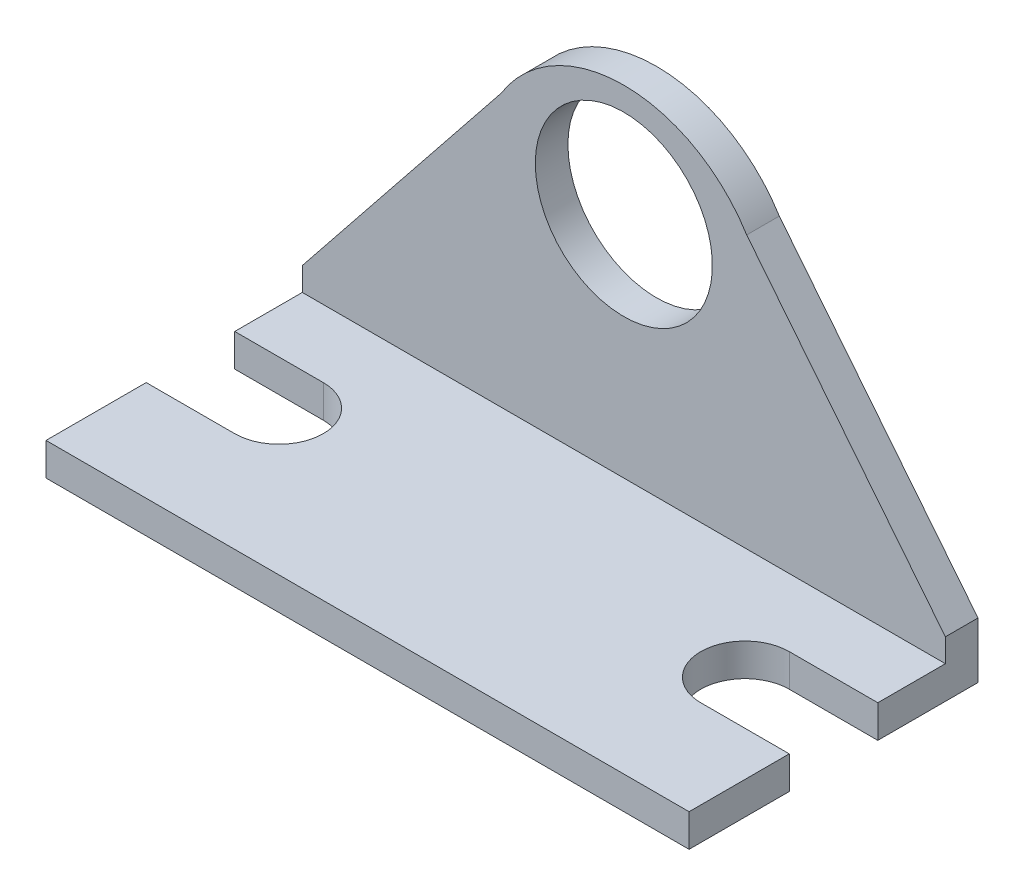
ISO-10303-21;
HEADER;
FILE_DESCRIPTION(('STEP AP214'),'2;1');
FILE_NAME('part.step','',(''),(''),'','','');
FILE_SCHEMA(('AUTOMOTIVE_DESIGN { 1 0 10303 214 1 1 1 1 }'));
ENDSEC;
DATA;
#1=APPLICATION_CONTEXT('core data for automotive mechanical design processes');
#2=APPLICATION_PROTOCOL_DEFINITION('international standard','automotive_design',2000,#1);
#3=PRODUCT_CONTEXT('',#1,'mechanical');
#4=PRODUCT('Part','Part','',(#3));
#5=PRODUCT_RELATED_PRODUCT_CATEGORY('part','',(#4));
#6=PRODUCT_DEFINITION_FORMATION('','',#4);
#7=PRODUCT_DEFINITION_CONTEXT('part definition',#1,'design');
#8=PRODUCT_DEFINITION('design','',#6,#7);
#9=PRODUCT_DEFINITION_SHAPE('','',#8);
#10=(LENGTH_UNIT() NAMED_UNIT(*) SI_UNIT(.MILLI.,.METRE.));
#11=(NAMED_UNIT(*) PLANE_ANGLE_UNIT() SI_UNIT($,.RADIAN.));
#12=(NAMED_UNIT(*) SI_UNIT($,.STERADIAN.) SOLID_ANGLE_UNIT());
#13=UNCERTAINTY_MEASURE_WITH_UNIT(LENGTH_MEASURE(1.E-05),#10,'distance_accuracy_value','');
#14=(GEOMETRIC_REPRESENTATION_CONTEXT(3) GLOBAL_UNCERTAINTY_ASSIGNED_CONTEXT((#13)) GLOBAL_UNIT_ASSIGNED_CONTEXT((#10,
#11,#12)) REPRESENTATION_CONTEXT('',''));
#15=CARTESIAN_POINT('',(0.,0.,0.));
#16=DIRECTION('',(0.,0.,1.));
#17=DIRECTION('',(1.,0.,0.));
#18=AXIS2_PLACEMENT_3D('',#15,#16,#17);
#19=CARTESIAN_POINT('',(0.,1.778,7.874));
#20=DIRECTION('',(0.,0.,-1.));
#21=DIRECTION('',(-1.,0.,0.));
#22=AXIS2_PLACEMENT_3D('',#19,#20,#21);
#23=PLANE('',#22);
#24=DIRECTION('',(1.,0.,0.));
#25=VECTOR('',#24,1.);
#26=CARTESIAN_POINT('',(0.,0.,7.874));
#27=LINE('',#26,#25);
#28=CARTESIAN_POINT('',(-17.526,0.,7.874));
#29=VERTEX_POINT('',#28);
#30=CARTESIAN_POINT('',(17.526,0.,7.874));
#31=VERTEX_POINT('',#30);
#32=EDGE_CURVE('E162',#29,#31,#27,.T.);
#33=ORIENTED_EDGE('',*,*,#32,.T.);
#34=DIRECTION('',(0.,-1.,0.));
#35=VECTOR('',#34,1.);
#36=CARTESIAN_POINT('',(17.526,1.778,7.874));
#37=LINE('',#36,#35);
#38=CARTESIAN_POINT('',(17.526,1.778,7.874));
#39=VERTEX_POINT('',#38);
#40=EDGE_CURVE('E11',#39,#31,#37,.T.);
#41=ORIENTED_EDGE('',*,*,#40,.F.);
#42=DIRECTION('',(1.,0.,0.));
#43=VECTOR('',#42,1.);
#44=CARTESIAN_POINT('',(0.,1.778,7.874));
#45=LINE('',#44,#43);
#46=CARTESIAN_POINT('',(-17.526,1.778,7.874));
#47=VERTEX_POINT('',#46);
#48=EDGE_CURVE('E109',#47,#39,#45,.T.);
#49=ORIENTED_EDGE('',*,*,#48,.F.);
#50=DIRECTION('',(0.,-1.,0.));
#51=VECTOR('',#50,1.);
#52=CARTESIAN_POINT('',(-17.526,1.778,7.874));
#53=LINE('',#52,#51);
#54=EDGE_CURVE('E161',#47,#29,#53,.T.);
#55=ORIENTED_EDGE('',*,*,#54,.T.);
#56=EDGE_LOOP('',(#33,#41,#49,#55));
#57=FACE_BOUND('',#56,.T.);
#58=ADVANCED_FACE('F35',(#57),#23,.F.);
#59=CARTESIAN_POINT('',(17.526,1.778,0.));
#60=DIRECTION('',(1.,0.,0.));
#61=DIRECTION('',(0.,0.,-1.));
#62=AXIS2_PLACEMENT_3D('',#59,#60,#61);
#63=PLANE('',#62);
#64=DIRECTION('',(0.,0.,1.));
#65=VECTOR('',#64,1.);
#66=CARTESIAN_POINT('',(17.526,0.,0.));
#67=LINE('',#66,#65);
#68=CARTESIAN_POINT('',(17.526,0.,2.413));
#69=VERTEX_POINT('',#68);
#70=EDGE_CURVE('E165',#69,#31,#67,.T.);
#71=ORIENTED_EDGE('',*,*,#70,.F.);
#72=DIRECTION('',(0.,-1.,0.));
#73=VECTOR('',#72,1.);
#74=CARTESIAN_POINT('',(17.526,1.778,2.413));
#75=LINE('',#74,#73);
#76=CARTESIAN_POINT('',(17.526,1.778,2.413));
#77=VERTEX_POINT('',#76);
#78=EDGE_CURVE('E43',#77,#69,#75,.T.);
#79=ORIENTED_EDGE('',*,*,#78,.F.);
#80=DIRECTION('',(0.,0.,1.));
#81=VECTOR('',#80,1.);
#82=CARTESIAN_POINT('',(17.526,1.778,0.));
#83=LINE('',#82,#81);
#84=EDGE_CURVE('E224',#77,#39,#83,.T.);
#85=ORIENTED_EDGE('',*,*,#84,.T.);
#86=ORIENTED_EDGE('',*,*,#40,.T.);
#87=EDGE_LOOP('',(#71,#79,#85,#86));
#88=FACE_BOUND('',#87,.T.);
#89=ADVANCED_FACE('F324',(#88),#63,.T.);
#90=CARTESIAN_POINT('',(0.,1.778,2.41299999999998));
#91=DIRECTION('',(0.,0.,-1.));
#92=DIRECTION('',(-1.,0.,0.));
#93=AXIS2_PLACEMENT_3D('',#90,#91,#92);
#94=PLANE('',#93);
#95=DIRECTION('',(1.,0.,0.));
#96=VECTOR('',#95,1.);
#97=CARTESIAN_POINT('',(0.,0.,2.41299999999998));
#98=LINE('',#97,#96);
#99=CARTESIAN_POINT('',(12.7,0.,2.41299999999999));
#100=VERTEX_POINT('',#99);
#101=EDGE_CURVE('E169',#100,#69,#98,.T.);
#102=ORIENTED_EDGE('',*,*,#101,.F.);
#103=DIRECTION('',(0.,-1.,0.));
#104=VECTOR('',#103,1.);
#105=CARTESIAN_POINT('',(12.7,1.778,2.41299999999999));
#106=LINE('',#105,#104);
#107=CARTESIAN_POINT('',(12.7,1.778,2.41299999999999));
#108=VERTEX_POINT('',#107);
#109=EDGE_CURVE('E207',#108,#100,#106,.T.);
#110=ORIENTED_EDGE('',*,*,#109,.F.);
#111=DIRECTION('',(1.,0.,0.));
#112=VECTOR('',#111,1.);
#113=CARTESIAN_POINT('',(0.,1.778,2.41299999999998));
#114=LINE('',#113,#112);
#115=EDGE_CURVE('E221',#108,#77,#114,.T.);
#116=ORIENTED_EDGE('',*,*,#115,.T.);
#117=ORIENTED_EDGE('',*,*,#78,.T.);
#118=EDGE_LOOP('',(#102,#110,#116,#117));
#119=FACE_BOUND('',#118,.T.);
#120=ADVANCED_FACE('F329',(#119),#94,.T.);
#121=CARTESIAN_POINT('',(12.7,1.778,0.));
#122=DIRECTION('',(0.,-1.,0.));
#123=DIRECTION('',(0.,0.,-1.));
#124=AXIS2_PLACEMENT_3D('',#121,#122,#123);
#125=CYLINDRICAL_SURFACE('',#124,2.41299999999999);
#126=CARTESIAN_POINT('',(12.7,0.,0.));
#127=DIRECTION('',(0.,1.,0.));
#128=DIRECTION('',(0.,0.,1.));
#129=AXIS2_PLACEMENT_3D('',#126,#127,#128);
#130=CIRCLE('',#129,2.41299999999999);
#131=CARTESIAN_POINT('',(12.7,0.,-2.413));
#132=VERTEX_POINT('',#131);
#133=EDGE_CURVE('E172',#100,#132,#130,.F.);
#134=ORIENTED_EDGE('',*,*,#133,.T.);
#135=DIRECTION('',(0.,-1.,0.));
#136=VECTOR('',#135,1.);
#137=CARTESIAN_POINT('',(12.7,1.778,-2.413));
#138=LINE('',#137,#136);
#139=CARTESIAN_POINT('',(12.7,1.778,-2.413));
#140=VERTEX_POINT('',#139);
#141=EDGE_CURVE('E204',#140,#132,#138,.T.);
#142=ORIENTED_EDGE('',*,*,#141,.F.);
#143=CARTESIAN_POINT('',(12.7,1.778,0.));
#144=DIRECTION('',(0.,1.,0.));
#145=DIRECTION('',(0.,0.,1.));
#146=AXIS2_PLACEMENT_3D('',#143,#144,#145);
#147=CIRCLE('',#146,2.41299999999999);
#148=EDGE_CURVE('E219',#108,#140,#147,.F.);
#149=ORIENTED_EDGE('',*,*,#148,.F.);
#150=ORIENTED_EDGE('',*,*,#109,.T.);
#151=EDGE_LOOP('',(#134,#142,#149,#150));
#152=FACE_BOUND('',#151,.T.);
#153=ADVANCED_FACE('F320',(#152),#125,.F.);
#154=CARTESIAN_POINT('',(0.,1.778,-2.41299999999999));
#155=DIRECTION('',(0.,0.,-1.));
#156=DIRECTION('',(-1.,0.,0.));
#157=AXIS2_PLACEMENT_3D('',#154,#155,#156);
#158=PLANE('',#157);
#159=DIRECTION('',(1.,0.,0.));
#160=VECTOR('',#159,1.);
#161=CARTESIAN_POINT('',(0.,0.,-2.41299999999999));
#162=LINE('',#161,#160);
#163=CARTESIAN_POINT('',(17.526,0.,-2.413));
#164=VERTEX_POINT('',#163);
#165=EDGE_CURVE('E174',#132,#164,#162,.T.);
#166=ORIENTED_EDGE('',*,*,#165,.T.);
#167=DIRECTION('',(0.,-1.,0.));
#168=VECTOR('',#167,1.);
#169=CARTESIAN_POINT('',(17.526,1.778,-2.413));
#170=LINE('',#169,#168);
#171=CARTESIAN_POINT('',(17.526,1.778,-2.413));
#172=VERTEX_POINT('',#171);
#173=EDGE_CURVE('E201',#172,#164,#170,.T.);
#174=ORIENTED_EDGE('',*,*,#173,.F.);
#175=DIRECTION('',(1.,0.,0.));
#176=VECTOR('',#175,1.);
#177=CARTESIAN_POINT('',(0.,1.778,-2.41299999999999));
#178=LINE('',#177,#176);
#179=EDGE_CURVE('E213',#140,#172,#178,.T.);
#180=ORIENTED_EDGE('',*,*,#179,.F.);
#181=ORIENTED_EDGE('',*,*,#141,.T.);
#182=EDGE_LOOP('',(#166,#174,#180,#181));
#183=FACE_BOUND('',#182,.T.);
#184=ADVANCED_FACE('F313',(#183),#158,.F.);
#185=CARTESIAN_POINT('',(17.526,1.778,0.));
#186=DIRECTION('',(-1.,0.,0.));
#187=DIRECTION('',(0.,0.,1.));
#188=AXIS2_PLACEMENT_3D('',#185,#186,#187);
#189=PLANE('',#188);
#190=DIRECTION('',(0.,0.,-1.));
#191=VECTOR('',#190,1.);
#192=CARTESIAN_POINT('',(17.526,0.,0.));
#193=LINE('',#192,#191);
#194=CARTESIAN_POINT('',(17.526,0.,-7.874));
#195=VERTEX_POINT('',#194);
#196=EDGE_CURVE('E176',#164,#195,#193,.T.);
#197=ORIENTED_EDGE('',*,*,#196,.T.);
#198=DIRECTION('',(0.,-1.,0.));
#199=VECTOR('',#198,1.);
#200=CARTESIAN_POINT('',(17.526,1.778,-7.874));
#201=LINE('',#200,#199);
#202=CARTESIAN_POINT('',(17.526,3.048,-7.874));
#203=VERTEX_POINT('',#202);
#204=EDGE_CURVE('E199',#203,#195,#201,.T.);
#205=ORIENTED_EDGE('',*,*,#204,.F.);
#206=DIRECTION('',(0.,0.,-1.));
#207=VECTOR('',#206,1.);
#208=CARTESIAN_POINT('',(17.526,3.048,-6.096));
#209=LINE('',#208,#207);
#210=CARTESIAN_POINT('',(17.526,3.048,-6.096));
#211=VERTEX_POINT('',#210);
#212=EDGE_CURVE('E235',#211,#203,#209,.T.);
#213=ORIENTED_EDGE('',*,*,#212,.F.);
#214=DIRECTION('',(0.,1.,0.));
#215=VECTOR('',#214,1.);
#216=CARTESIAN_POINT('',(17.526,0.,-6.096));
#217=LINE('',#216,#215);
#218=CARTESIAN_POINT('',(17.526,1.778,-6.096));
#219=VERTEX_POINT('',#218);
#220=EDGE_CURVE('E259',#219,#211,#217,.T.);
#221=ORIENTED_EDGE('',*,*,#220,.F.);
#222=DIRECTION('',(0.,0.,-1.));
#223=VECTOR('',#222,1.);
#224=CARTESIAN_POINT('',(17.526,1.778,0.));
#225=LINE('',#224,#223);
#226=EDGE_CURVE('E210',#172,#219,#225,.T.);
#227=ORIENTED_EDGE('',*,*,#226,.F.);
#228=ORIENTED_EDGE('',*,*,#173,.T.);
#229=EDGE_LOOP('',(#197,#205,#213,#221,#227,#228));
#230=FACE_BOUND('',#229,.T.);
#231=ADVANCED_FACE('F309',(#230),#189,.F.);
#232=CARTESIAN_POINT('',(0.,1.778,-7.874));
#233=DIRECTION('',(0.,0.,-1.));
#234=DIRECTION('',(-1.,0.,0.));
#235=AXIS2_PLACEMENT_3D('',#232,#233,#234);
#236=PLANE('',#235);
#237=DIRECTION('',(1.,0.,0.));
#238=VECTOR('',#237,1.);
#239=CARTESIAN_POINT('',(0.,0.,-7.874));
#240=LINE('',#239,#238);
#241=CARTESIAN_POINT('',(-17.526,0.,-7.874));
#242=VERTEX_POINT('',#241);
#243=EDGE_CURVE('E179',#242,#195,#240,.T.);
#244=ORIENTED_EDGE('',*,*,#243,.F.);
#245=DIRECTION('',(0.,-1.,0.));
#246=VECTOR('',#245,1.);
#247=CARTESIAN_POINT('',(-17.526,1.778,-7.874));
#248=LINE('',#247,#246);
#249=CARTESIAN_POINT('',(-17.526,3.048,-7.874));
#250=VERTEX_POINT('',#249);
#251=EDGE_CURVE('E197',#250,#242,#248,.T.);
#252=ORIENTED_EDGE('',*,*,#251,.F.);
#253=DIRECTION('',(0.624572109785779,0.780967143788867,0.));
#254=VECTOR('',#253,1.);
#255=CARTESIAN_POINT('',(-12.176000910281,9.73765751577342,-7.874));
#256=LINE('',#255,#254);
#257=CARTESIAN_POINT('',(-6.68977554130048,16.5976528461193,-7.874));
#258=VERTEX_POINT('',#257);
#259=EDGE_CURVE('E247',#250,#258,#256,.T.);
#260=ORIENTED_EDGE('',*,*,#259,.T.);
#261=CARTESIAN_POINT('',(0.0050574143905339,12.4528865444572,-7.874));
#262=DIRECTION('',(0.,0.,-1.));
#263=DIRECTION('',(-1.,0.,0.));
#264=AXIS2_PLACEMENT_3D('',#261,#262,#263);
#265=CIRCLE('',#264,7.874);
#266=CARTESIAN_POINT('',(6.69653989656772,16.6030598168298,-7.874));
#267=VERTEX_POINT('',#266);
#268=EDGE_CURVE('E244',#258,#267,#265,.T.);
#269=ORIENTED_EDGE('',*,*,#268,.T.);
#270=DIRECTION('',(-0.624182229744378,0.781278787675268,0.));
#271=VECTOR('',#270,1.);
#272=CARTESIAN_POINT('',(12.1841985347393,9.73424637790472,-7.874));
#273=LINE('',#272,#271);
#274=EDGE_CURVE('E240',#203,#267,#273,.T.);
#275=ORIENTED_EDGE('',*,*,#274,.F.);
#276=ORIENTED_EDGE('',*,*,#204,.T.);
#277=EDGE_LOOP('',(#244,#252,#260,#269,#275,#276));
#278=FACE_BOUND('',#277,.T.);
#279=CARTESIAN_POINT('',(0.,14.224,-7.874));
#280=DIRECTION('',(0.,0.,-1.));
#281=DIRECTION('',(-1.,0.,0.));
#282=AXIS2_PLACEMENT_3D('',#279,#280,#281);
#283=CIRCLE('',#282,4.826);
#284=CARTESIAN_POINT('',(-4.82599999999999,14.224,-7.874));
#285=VERTEX_POINT('',#284);
#286=EDGE_CURVE('E250',#285,#285,#283,.T.);
#287=ORIENTED_EDGE('',*,*,#286,.F.);
#288=EDGE_LOOP('',(#287));
#289=FACE_BOUND('',#288,.T.);
#290=ADVANCED_FACE('F312',(#278,#289),#236,.T.);
#291=CARTESIAN_POINT('',(-17.526,1.778,0.));
#292=DIRECTION('',(-1.,0.,0.));
#293=DIRECTION('',(0.,0.,1.));
#294=AXIS2_PLACEMENT_3D('',#291,#292,#293);
#295=PLANE('',#294);
#296=DIRECTION('',(0.,0.,-1.));
#297=VECTOR('',#296,1.);
#298=CARTESIAN_POINT('',(-17.526,0.,0.));
#299=LINE('',#298,#297);
#300=CARTESIAN_POINT('',(-17.526,0.,-2.413));
#301=VERTEX_POINT('',#300);
#302=EDGE_CURVE('E182',#301,#242,#299,.T.);
#303=ORIENTED_EDGE('',*,*,#302,.F.);
#304=DIRECTION('',(0.,-1.,0.));
#305=VECTOR('',#304,1.);
#306=CARTESIAN_POINT('',(-17.526,1.778,-2.413));
#307=LINE('',#306,#305);
#308=CARTESIAN_POINT('',(-17.526,1.778,-2.413));
#309=VERTEX_POINT('',#308);
#310=EDGE_CURVE('E195',#309,#301,#307,.T.);
#311=ORIENTED_EDGE('',*,*,#310,.F.);
#312=DIRECTION('',(0.,0.,-1.));
#313=VECTOR('',#312,1.);
#314=CARTESIAN_POINT('',(-17.526,1.778,0.));
#315=LINE('',#314,#313);
#316=CARTESIAN_POINT('',(-17.526,1.778,-6.096));
#317=VERTEX_POINT('',#316);
#318=EDGE_CURVE('E156',#309,#317,#315,.T.);
#319=ORIENTED_EDGE('',*,*,#318,.T.);
#320=DIRECTION('',(0.,-1.,0.));
#321=VECTOR('',#320,1.);
#322=CARTESIAN_POINT('',(-17.526,0.,-6.096));
#323=LINE('',#322,#321);
#324=CARTESIAN_POINT('',(-17.526,3.048,-6.096));
#325=VERTEX_POINT('',#324);
#326=EDGE_CURVE('E232',#325,#317,#323,.T.);
#327=ORIENTED_EDGE('',*,*,#326,.F.);
#328=DIRECTION('',(0.,0.,-1.));
#329=VECTOR('',#328,1.);
#330=CARTESIAN_POINT('',(-17.526,3.048,-6.096));
#331=LINE('',#330,#329);
#332=EDGE_CURVE('E166',#325,#250,#331,.T.);
#333=ORIENTED_EDGE('',*,*,#332,.T.);
#334=ORIENTED_EDGE('',*,*,#251,.T.);
#335=EDGE_LOOP('',(#303,#311,#319,#327,#333,#334));
#336=FACE_BOUND('',#335,.T.);
#337=ADVANCED_FACE('F273',(#336),#295,.T.);
#338=CARTESIAN_POINT('',(0.,1.778,-2.41299999999999));
#339=DIRECTION('',(0.,0.,1.));
#340=DIRECTION('',(1.,0.,0.));
#341=AXIS2_PLACEMENT_3D('',#338,#339,#340);
#342=PLANE('',#341);
#343=DIRECTION('',(-1.,0.,0.));
#344=VECTOR('',#343,1.);
#345=CARTESIAN_POINT('',(0.,0.,-2.41299999999999));
#346=LINE('',#345,#344);
#347=CARTESIAN_POINT('',(-12.7,0.,-2.413));
#348=VERTEX_POINT('',#347);
#349=EDGE_CURVE('E185',#348,#301,#346,.T.);
#350=ORIENTED_EDGE('',*,*,#349,.F.);
#351=DIRECTION('',(0.,-1.,0.));
#352=VECTOR('',#351,1.);
#353=CARTESIAN_POINT('',(-12.7,1.778,-2.413));
#354=LINE('',#353,#352);
#355=CARTESIAN_POINT('',(-12.7,1.778,-2.413));
#356=VERTEX_POINT('',#355);
#357=EDGE_CURVE('E144',#356,#348,#354,.T.);
#358=ORIENTED_EDGE('',*,*,#357,.F.);
#359=DIRECTION('',(-1.,0.,0.));
#360=VECTOR('',#359,1.);
#361=CARTESIAN_POINT('',(0.,1.778,-2.41299999999999));
#362=LINE('',#361,#360);
#363=EDGE_CURVE('E154',#356,#309,#362,.T.);
#364=ORIENTED_EDGE('',*,*,#363,.T.);
#365=ORIENTED_EDGE('',*,*,#310,.T.);
#366=EDGE_LOOP('',(#350,#358,#364,#365));
#367=FACE_BOUND('',#366,.T.);
#368=ADVANCED_FACE('F378',(#367),#342,.T.);
#369=CARTESIAN_POINT('',(-12.7,1.778,0.));
#370=DIRECTION('',(0.,-1.,0.));
#371=DIRECTION('',(0.,0.,-1.));
#372=AXIS2_PLACEMENT_3D('',#369,#370,#371);
#373=CYLINDRICAL_SURFACE('',#372,2.41299999999999);
#374=CARTESIAN_POINT('',(-12.7,0.,0.));
#375=DIRECTION('',(0.,1.,0.));
#376=DIRECTION('',(0.,0.,1.));
#377=AXIS2_PLACEMENT_3D('',#374,#375,#376);
#378=CIRCLE('',#377,2.41299999999999);
#379=CARTESIAN_POINT('',(-12.7,0.,2.41299999999999));
#380=VERTEX_POINT('',#379);
#381=EDGE_CURVE('E141',#380,#348,#378,.T.);
#382=ORIENTED_EDGE('',*,*,#381,.F.);
#383=DIRECTION('',(0.,-1.,0.));
#384=VECTOR('',#383,1.);
#385=CARTESIAN_POINT('',(-12.7,1.778,2.41299999999999));
#386=LINE('',#385,#384);
#387=CARTESIAN_POINT('',(-12.7,1.778,2.41299999999999));
#388=VERTEX_POINT('',#387);
#389=EDGE_CURVE('E135',#388,#380,#386,.T.);
#390=ORIENTED_EDGE('',*,*,#389,.F.);
#391=CARTESIAN_POINT('',(-12.7,1.778,0.));
#392=DIRECTION('',(0.,1.,0.));
#393=DIRECTION('',(0.,0.,1.));
#394=AXIS2_PLACEMENT_3D('',#391,#392,#393);
#395=CIRCLE('',#394,2.41299999999999);
#396=EDGE_CURVE('E139',#388,#356,#395,.T.);
#397=ORIENTED_EDGE('',*,*,#396,.T.);
#398=ORIENTED_EDGE('',*,*,#357,.T.);
#399=EDGE_LOOP('',(#382,#390,#397,#398));
#400=FACE_BOUND('',#399,.T.);
#401=ADVANCED_FACE('F137',(#400),#373,.F.);
#402=CARTESIAN_POINT('',(0.,1.778,2.41299999999998));
#403=DIRECTION('',(0.,0.,1.));
#404=DIRECTION('',(1.,0.,0.));
#405=AXIS2_PLACEMENT_3D('',#402,#403,#404);
#406=PLANE('',#405);
#407=DIRECTION('',(-1.,0.,0.));
#408=VECTOR('',#407,1.);
#409=CARTESIAN_POINT('',(0.,0.,2.41299999999998));
#410=LINE('',#409,#408);
#411=CARTESIAN_POINT('',(-17.526,0.,2.413));
#412=VERTEX_POINT('',#411);
#413=EDGE_CURVE('E189',#380,#412,#410,.T.);
#414=ORIENTED_EDGE('',*,*,#413,.T.);
#415=DIRECTION('',(0.,-1.,0.));
#416=VECTOR('',#415,1.);
#417=CARTESIAN_POINT('',(-17.526,1.778,2.413));
#418=LINE('',#417,#416);
#419=CARTESIAN_POINT('',(-17.526,1.778,2.413));
#420=VERTEX_POINT('',#419);
#421=EDGE_CURVE('E145',#420,#412,#418,.T.);
#422=ORIENTED_EDGE('',*,*,#421,.F.);
#423=DIRECTION('',(-1.,0.,0.));
#424=VECTOR('',#423,1.);
#425=CARTESIAN_POINT('',(0.,1.778,2.41299999999998));
#426=LINE('',#425,#424);
#427=EDGE_CURVE('E148',#388,#420,#426,.T.);
#428=ORIENTED_EDGE('',*,*,#427,.F.);
#429=ORIENTED_EDGE('',*,*,#389,.T.);
#430=EDGE_LOOP('',(#414,#422,#428,#429));
#431=FACE_BOUND('',#430,.T.);
#432=ADVANCED_FACE('F149',(#431),#406,.F.);
#433=CARTESIAN_POINT('',(-17.526,1.778,0.));
#434=DIRECTION('',(1.,0.,0.));
#435=DIRECTION('',(0.,0.,-1.));
#436=AXIS2_PLACEMENT_3D('',#433,#434,#435);
#437=PLANE('',#436);
#438=DIRECTION('',(0.,0.,1.));
#439=VECTOR('',#438,1.);
#440=CARTESIAN_POINT('',(-17.526,0.,0.));
#441=LINE('',#440,#439);
#442=EDGE_CURVE('E103',#412,#29,#441,.T.);
#443=ORIENTED_EDGE('',*,*,#442,.T.);
#444=ORIENTED_EDGE('',*,*,#54,.F.);
#445=DIRECTION('',(0.,0.,1.));
#446=VECTOR('',#445,1.);
#447=CARTESIAN_POINT('',(-17.526,1.778,0.));
#448=LINE('',#447,#446);
#449=EDGE_CURVE('E59',#420,#47,#448,.T.);
#450=ORIENTED_EDGE('',*,*,#449,.F.);
#451=ORIENTED_EDGE('',*,*,#421,.T.);
#452=EDGE_LOOP('',(#443,#444,#450,#451));
#453=FACE_BOUND('',#452,.T.);
#454=ADVANCED_FACE('F369',(#453),#437,.F.);
#455=CARTESIAN_POINT('',(0.,1.778,0.));
#456=DIRECTION('',(0.,1.,0.));
#457=DIRECTION('',(0.,0.,1.));
#458=AXIS2_PLACEMENT_3D('',#455,#456,#457);
#459=PLANE('',#458);
#460=DIRECTION('',(1.,0.,0.));
#461=VECTOR('',#460,1.);
#462=CARTESIAN_POINT('',(0.,1.778,-6.096));
#463=LINE('',#462,#461);
#464=EDGE_CURVE('E51',#317,#219,#463,.T.);
#465=ORIENTED_EDGE('',*,*,#464,.F.);
#466=ORIENTED_EDGE('',*,*,#318,.F.);
#467=ORIENTED_EDGE('',*,*,#363,.F.);
#468=ORIENTED_EDGE('',*,*,#396,.F.);
#469=ORIENTED_EDGE('',*,*,#427,.T.);
#470=ORIENTED_EDGE('',*,*,#449,.T.);
#471=ORIENTED_EDGE('',*,*,#48,.T.);
#472=ORIENTED_EDGE('',*,*,#84,.F.);
#473=ORIENTED_EDGE('',*,*,#115,.F.);
#474=ORIENTED_EDGE('',*,*,#148,.T.);
#475=ORIENTED_EDGE('',*,*,#179,.T.);
#476=ORIENTED_EDGE('',*,*,#226,.T.);
#477=EDGE_LOOP('',(#465,#466,#467,#468,#469,#470,#471,#472,#473,#474,#475,#476));
#478=FACE_BOUND('',#477,.T.);
#479=ADVANCED_FACE('F152',(#478),#459,.T.);
#480=CARTESIAN_POINT('',(0.,0.,0.));
#481=DIRECTION('',(0.,1.,0.));
#482=DIRECTION('',(0.,0.,1.));
#483=AXIS2_PLACEMENT_3D('',#480,#481,#482);
#484=PLANE('',#483);
#485=ORIENTED_EDGE('',*,*,#32,.F.);
#486=ORIENTED_EDGE('',*,*,#442,.F.);
#487=ORIENTED_EDGE('',*,*,#413,.F.);
#488=ORIENTED_EDGE('',*,*,#381,.T.);
#489=ORIENTED_EDGE('',*,*,#349,.T.);
#490=ORIENTED_EDGE('',*,*,#302,.T.);
#491=ORIENTED_EDGE('',*,*,#243,.T.);
#492=ORIENTED_EDGE('',*,*,#196,.F.);
#493=ORIENTED_EDGE('',*,*,#165,.F.);
#494=ORIENTED_EDGE('',*,*,#133,.F.);
#495=ORIENTED_EDGE('',*,*,#101,.T.);
#496=ORIENTED_EDGE('',*,*,#70,.T.);
#497=EDGE_LOOP('',(#485,#486,#487,#488,#489,#490,#491,#492,#493,#494,#495,#496));
#498=FACE_BOUND('',#497,.T.);
#499=ADVANCED_FACE('F334',(#498),#484,.F.);
#500=CARTESIAN_POINT('',(-12.176000910281,9.73765751577342,-6.096));
#501=DIRECTION('',(-0.780967143788867,0.624572109785779,0.));
#502=DIRECTION('',(-0.624572109785779,-0.780967143788867,0.));
#503=AXIS2_PLACEMENT_3D('',#500,#501,#502);
#504=PLANE('',#503);
#505=ORIENTED_EDGE('',*,*,#259,.F.);
#506=ORIENTED_EDGE('',*,*,#332,.F.);
#507=DIRECTION('',(0.624572109785779,0.780967143788867,0.));
#508=VECTOR('',#507,1.);
#509=CARTESIAN_POINT('',(-12.176000910281,9.73765751577342,-6.096));
#510=LINE('',#509,#508);
#511=CARTESIAN_POINT('',(-6.68977554130048,16.5976528461193,-6.096));
#512=VERTEX_POINT('',#511);
#513=EDGE_CURVE('E270',#325,#512,#510,.T.);
#514=ORIENTED_EDGE('',*,*,#513,.T.);
#515=DIRECTION('',(0.,0.,-1.));
#516=VECTOR('',#515,1.);
#517=CARTESIAN_POINT('',(-6.68977554130048,16.5976528461193,-6.096));
#518=LINE('',#517,#516);
#519=EDGE_CURVE('E228',#512,#258,#518,.T.);
#520=ORIENTED_EDGE('',*,*,#519,.T.);
#521=EDGE_LOOP('',(#505,#506,#514,#520));
#522=FACE_BOUND('',#521,.T.);
#523=ADVANCED_FACE('F363',(#522),#504,.T.);
#524=CARTESIAN_POINT('',(12.1841985347393,9.73424637790472,-6.096));
#525=DIRECTION('',(-0.781278787675268,-0.624182229744378,0.));
#526=DIRECTION('',(0.624182229744378,-0.781278787675268,0.));
#527=AXIS2_PLACEMENT_3D('',#524,#525,#526);
#528=PLANE('',#527);
#529=ORIENTED_EDGE('',*,*,#274,.T.);
#530=DIRECTION('',(0.,0.,-1.));
#531=VECTOR('',#530,1.);
#532=CARTESIAN_POINT('',(6.69653989656772,16.6030598168298,-6.096));
#533=LINE('',#532,#531);
#534=CARTESIAN_POINT('',(6.69653989656772,16.6030598168298,-6.096));
#535=VERTEX_POINT('',#534);
#536=EDGE_CURVE('E231',#535,#267,#533,.T.);
#537=ORIENTED_EDGE('',*,*,#536,.F.);
#538=DIRECTION('',(-0.624182229744378,0.781278787675268,0.));
#539=VECTOR('',#538,1.);
#540=CARTESIAN_POINT('',(12.1841985347393,9.73424637790472,-6.096));
#541=LINE('',#540,#539);
#542=EDGE_CURVE('E255',#211,#535,#541,.T.);
#543=ORIENTED_EDGE('',*,*,#542,.F.);
#544=ORIENTED_EDGE('',*,*,#212,.T.);
#545=EDGE_LOOP('',(#529,#537,#543,#544));
#546=FACE_BOUND('',#545,.T.);
#547=ADVANCED_FACE('F305',(#546),#528,.F.);
#548=CARTESIAN_POINT('',(0.,14.224,-6.096));
#549=DIRECTION('',(0.,0.,-1.));
#550=DIRECTION('',(-1.,0.,0.));
#551=AXIS2_PLACEMENT_3D('',#548,#549,#550);
#552=CYLINDRICAL_SURFACE('',#551,4.826);
#553=CARTESIAN_POINT('',(0.,14.224,-6.096));
#554=DIRECTION('',(0.,0.,-1.));
#555=DIRECTION('',(-1.,0.,0.));
#556=AXIS2_PLACEMENT_3D('',#553,#554,#555);
#557=CIRCLE('',#556,4.826);
#558=CARTESIAN_POINT('',(-4.82599999999999,14.224,-6.096));
#559=VERTEX_POINT('',#558);
#560=EDGE_CURVE('E243',#559,#559,#557,.T.);
#561=ORIENTED_EDGE('',*,*,#560,.F.);
#562=EDGE_LOOP('',(#561));
#563=FACE_BOUND('',#562,.T.);
#564=ORIENTED_EDGE('',*,*,#286,.T.);
#565=EDGE_LOOP('',(#564));
#566=FACE_BOUND('',#565,.T.);
#567=ADVANCED_FACE('F353',(#563,#566),#552,.F.);
#568=CARTESIAN_POINT('',(0.0050574143905339,12.4528865444572,-6.096));
#569=DIRECTION('',(0.,0.,-1.));
#570=DIRECTION('',(-1.,0.,0.));
#571=AXIS2_PLACEMENT_3D('',#568,#569,#570);
#572=CYLINDRICAL_SURFACE('',#571,7.874);
#573=ORIENTED_EDGE('',*,*,#268,.F.);
#574=ORIENTED_EDGE('',*,*,#519,.F.);
#575=CARTESIAN_POINT('',(0.0050574143905339,12.4528865444572,-6.096));
#576=DIRECTION('',(0.,0.,-1.));
#577=DIRECTION('',(-1.,0.,0.));
#578=AXIS2_PLACEMENT_3D('',#575,#576,#577);
#579=CIRCLE('',#578,7.874);
#580=EDGE_CURVE('E306',#512,#535,#579,.T.);
#581=ORIENTED_EDGE('',*,*,#580,.T.);
#582=ORIENTED_EDGE('',*,*,#536,.T.);
#583=EDGE_LOOP('',(#573,#574,#581,#582));
#584=FACE_BOUND('',#583,.T.);
#585=ADVANCED_FACE('F346',(#584),#572,.T.);
#586=CARTESIAN_POINT('',(0.,0.,-6.096));
#587=DIRECTION('',(0.,0.,-1.));
#588=DIRECTION('',(-1.,0.,0.));
#589=AXIS2_PLACEMENT_3D('',#586,#587,#588);
#590=PLANE('',#589);
#591=ORIENTED_EDGE('',*,*,#560,.T.);
#592=EDGE_LOOP('',(#591));
#593=FACE_BOUND('',#592,.T.);
#594=ORIENTED_EDGE('',*,*,#513,.F.);
#595=ORIENTED_EDGE('',*,*,#326,.T.);
#596=ORIENTED_EDGE('',*,*,#464,.T.);
#597=ORIENTED_EDGE('',*,*,#220,.T.);
#598=ORIENTED_EDGE('',*,*,#542,.T.);
#599=ORIENTED_EDGE('',*,*,#580,.F.);
#600=EDGE_LOOP('',(#594,#595,#596,#597,#598,#599));
#601=FACE_BOUND('',#600,.T.);
#602=ADVANCED_FACE('F265',(#593,#601),#590,.F.);
#603=CLOSED_SHELL('',(#58,#89,#120,#153,#184,#231,#290,#337,#368,#401,#432,#454,#479,#499,#523,
#547,#567,#585,#602));
#604=MANIFOLD_SOLID_BREP('B2',#603);
#605=ADVANCED_BREP_SHAPE_REPRESENTATION('',(#18,#604),#14);
#606=SHAPE_DEFINITION_REPRESENTATION(#9,#605);
ENDSEC;
END-ISO-10303-21;
